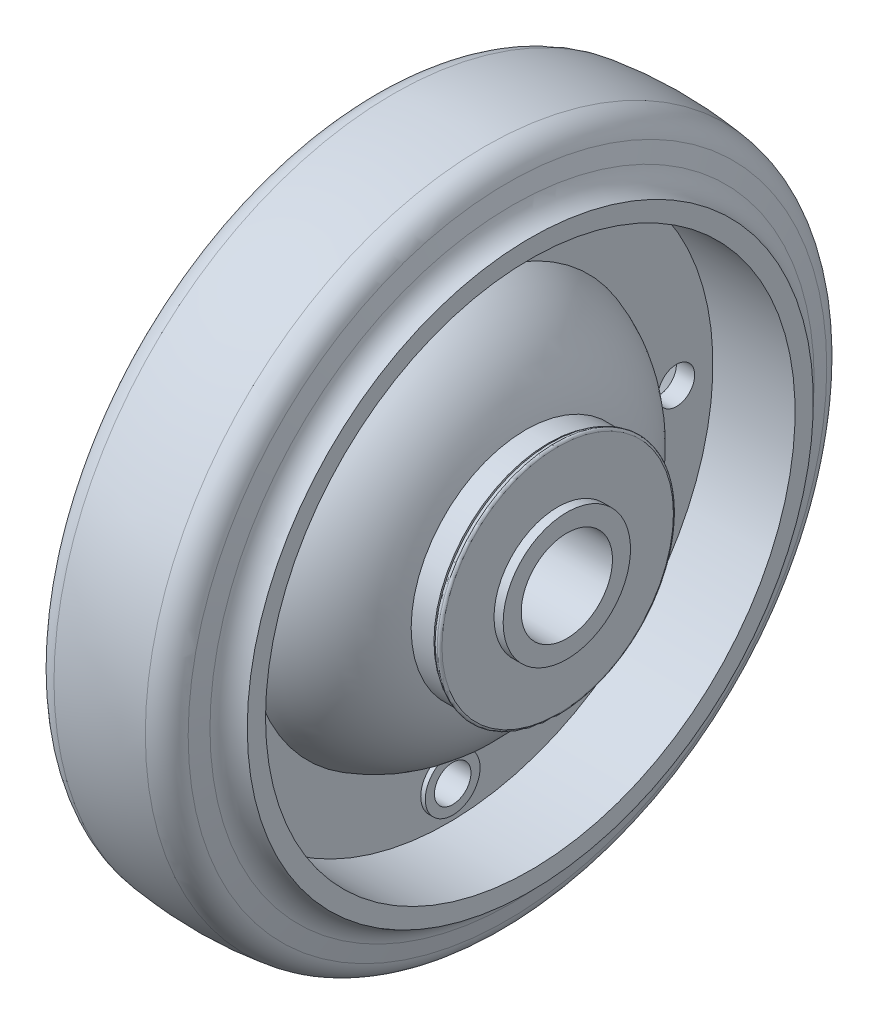
ISO-10303-21;
HEADER;
FILE_DESCRIPTION(('STEP AP214'),'2;1');
FILE_NAME('part.step','',(''),(''),'','','');
FILE_SCHEMA(('AUTOMOTIVE_DESIGN { 1 0 10303 214 1 1 1 1 }'));
ENDSEC;
DATA;
#1=APPLICATION_CONTEXT('core data for automotive mechanical design processes');
#2=APPLICATION_PROTOCOL_DEFINITION('international standard','automotive_design',2000,#1);
#3=PRODUCT_CONTEXT('',#1,'mechanical');
#4=PRODUCT('Part','Part','',(#3));
#5=PRODUCT_RELATED_PRODUCT_CATEGORY('part','',(#4));
#6=PRODUCT_DEFINITION_FORMATION('','',#4);
#7=PRODUCT_DEFINITION_CONTEXT('part definition',#1,'design');
#8=PRODUCT_DEFINITION('design','',#6,#7);
#9=PRODUCT_DEFINITION_SHAPE('','',#8);
#10=(LENGTH_UNIT() NAMED_UNIT(*) SI_UNIT(.MILLI.,.METRE.));
#11=(NAMED_UNIT(*) PLANE_ANGLE_UNIT() SI_UNIT($,.RADIAN.));
#12=(NAMED_UNIT(*) SI_UNIT($,.STERADIAN.) SOLID_ANGLE_UNIT());
#13=UNCERTAINTY_MEASURE_WITH_UNIT(LENGTH_MEASURE(1.E-05),#10,'distance_accuracy_value','');
#14=(GEOMETRIC_REPRESENTATION_CONTEXT(3) GLOBAL_UNCERTAINTY_ASSIGNED_CONTEXT((#13)) GLOBAL_UNIT_ASSIGNED_CONTEXT((#10,
#11,#12)) REPRESENTATION_CONTEXT('',''));
#15=CARTESIAN_POINT('',(0.,0.,0.));
#16=DIRECTION('',(0.,0.,1.));
#17=DIRECTION('',(1.,0.,0.));
#18=AXIS2_PLACEMENT_3D('',#15,#16,#17);
#19=CARTESIAN_POINT('',(2.,58.,0.));
#20=DIRECTION('',(-1.,0.,0.));
#21=DIRECTION('',(0.,0.,1.));
#22=AXIS2_PLACEMENT_3D('',#19,#20,#21);
#23=PLANE('',#22);
#24=CARTESIAN_POINT('',(2.,50.,0.));
#25=DIRECTION('',(-1.,0.,0.));
#26=DIRECTION('',(0.,0.,1.));
#27=AXIS2_PLACEMENT_3D('',#24,#25,#26);
#28=CIRCLE('',#27,6.);
#29=CARTESIAN_POINT('',(2.,50.,6.00000000000002));
#30=VERTEX_POINT('',#29);
#31=EDGE_CURVE('E19',#30,#30,#28,.F.);
#32=ORIENTED_EDGE('',*,*,#31,.F.);
#33=EDGE_LOOP('',(#32));
#34=FACE_BOUND('',#33,.T.);
#35=CARTESIAN_POINT('',(2.,0.,50.));
#36=DIRECTION('',(1.,0.,0.));
#37=DIRECTION('',(0.,0.,-1.));
#38=AXIS2_PLACEMENT_3D('',#35,#36,#37);
#39=CIRCLE('',#38,3.99999999999999);
#40=CARTESIAN_POINT('',(2.,0.,46.));
#41=VERTEX_POINT('',#40);
#42=EDGE_CURVE('E137',#41,#41,#39,.T.);
#43=ORIENTED_EDGE('',*,*,#42,.F.);
#44=EDGE_LOOP('',(#43));
#45=FACE_BOUND('',#44,.T.);
#46=CARTESIAN_POINT('',(2.,0.,-50.));
#47=DIRECTION('',(1.,0.,0.));
#48=DIRECTION('',(0.,0.,-1.));
#49=AXIS2_PLACEMENT_3D('',#46,#47,#48);
#50=CIRCLE('',#49,3.99999999999999);
#51=CARTESIAN_POINT('',(2.,0.,-54.));
#52=VERTEX_POINT('',#51);
#53=EDGE_CURVE('E131',#52,#52,#50,.T.);
#54=ORIENTED_EDGE('',*,*,#53,.F.);
#55=EDGE_LOOP('',(#54));
#56=FACE_BOUND('',#55,.T.);
#57=CARTESIAN_POINT('',(2.,0.,0.));
#58=DIRECTION('',(-1.,0.,0.));
#59=DIRECTION('',(0.,0.,1.));
#60=AXIS2_PLACEMENT_3D('',#57,#58,#59);
#61=CIRCLE('',#60,58.);
#62=CARTESIAN_POINT('',(2.,0.,58.));
#63=VERTEX_POINT('',#62);
#64=EDGE_CURVE('E56',#63,#63,#61,.T.);
#65=ORIENTED_EDGE('',*,*,#64,.F.);
#66=EDGE_LOOP('',(#65));
#67=FACE_BOUND('',#66,.T.);
#68=CARTESIAN_POINT('',(2.,0.,0.));
#69=DIRECTION('',(-1.,0.,0.));
#70=DIRECTION('',(0.,0.,1.));
#71=AXIS2_PLACEMENT_3D('',#68,#69,#70);
#72=CIRCLE('',#71,43.5);
#73=CARTESIAN_POINT('',(2.,0.,43.5));
#74=VERTEX_POINT('',#73);
#75=EDGE_CURVE('E53',#74,#74,#72,.T.);
#76=ORIENTED_EDGE('',*,*,#75,.T.);
#77=EDGE_LOOP('',(#76));
#78=FACE_BOUND('',#77,.T.);
#79=CARTESIAN_POINT('',(2.,-50.,0.));
#80=DIRECTION('',(-1.,0.,0.));
#81=DIRECTION('',(0.,0.,1.));
#82=AXIS2_PLACEMENT_3D('',#79,#80,#81);
#83=CIRCLE('',#82,6.);
#84=CARTESIAN_POINT('',(2.,-50.,5.99999999999999));
#85=VERTEX_POINT('',#84);
#86=EDGE_CURVE('E8',#85,#85,#83,.F.);
#87=ORIENTED_EDGE('',*,*,#86,.F.);
#88=EDGE_LOOP('',(#87));
#89=FACE_BOUND('',#88,.T.);
#90=ADVANCED_FACE('F12',(#34,#45,#56,#67,#78,#89),#23,.F.);
#91=CARTESIAN_POINT('',(28.,0.,0.));
#92=DIRECTION('',(-1.,0.,0.));
#93=DIRECTION('',(0.,0.,1.));
#94=AXIS2_PLACEMENT_3D('',#91,#92,#93);
#95=PLANE('',#94);
#96=CARTESIAN_POINT('',(28.,0.,0.));
#97=DIRECTION('',(-1.,0.,0.));
#98=DIRECTION('',(0.,0.,1.));
#99=AXIS2_PLACEMENT_3D('',#96,#97,#98);
#100=CIRCLE('',#99,13.95);
#101=CARTESIAN_POINT('',(28.,0.,13.95));
#102=VERTEX_POINT('',#101);
#103=EDGE_CURVE('E23',#102,#102,#100,.T.);
#104=ORIENTED_EDGE('',*,*,#103,.F.);
#105=EDGE_LOOP('',(#104));
#106=FACE_BOUND('',#105,.T.);
#107=CARTESIAN_POINT('',(28.,0.,0.));
#108=DIRECTION('',(1.,0.,0.));
#109=DIRECTION('',(0.,0.,-1.));
#110=AXIS2_PLACEMENT_3D('',#107,#108,#109);
#111=CIRCLE('',#110,9.99999999999999);
#112=CARTESIAN_POINT('',(28.,0.,-9.99999999999999));
#113=VERTEX_POINT('',#112);
#114=EDGE_CURVE('E125',#113,#113,#111,.T.);
#115=ORIENTED_EDGE('',*,*,#114,.F.);
#116=EDGE_LOOP('',(#115));
#117=FACE_BOUND('',#116,.T.);
#118=ADVANCED_FACE('F193',(#106,#117),#95,.F.);
#119=CARTESIAN_POINT('',(-28.,0.,0.));
#120=DIRECTION('',(1.,0.,0.));
#121=DIRECTION('',(0.,0.,-1.));
#122=AXIS2_PLACEMENT_3D('',#119,#120,#121);
#123=PLANE('',#122);
#124=CARTESIAN_POINT('',(-28.,0.,0.));
#125=DIRECTION('',(1.,0.,0.));
#126=DIRECTION('',(0.,0.,-1.));
#127=AXIS2_PLACEMENT_3D('',#124,#125,#126);
#128=CIRCLE('',#127,9.99999999999999);
#129=CARTESIAN_POINT('',(-28.,0.,-9.99999999999999));
#130=VERTEX_POINT('',#129);
#131=EDGE_CURVE('E122',#130,#130,#128,.T.);
#132=ORIENTED_EDGE('',*,*,#131,.T.);
#133=EDGE_LOOP('',(#132));
#134=FACE_BOUND('',#133,.T.);
#135=CARTESIAN_POINT('',(-28.,0.,0.));
#136=DIRECTION('',(-1.,0.,0.));
#137=DIRECTION('',(0.,0.,1.));
#138=AXIS2_PLACEMENT_3D('',#135,#136,#137);
#139=CIRCLE('',#138,13.95);
#140=CARTESIAN_POINT('',(-28.,0.,13.95));
#141=VERTEX_POINT('',#140);
#142=EDGE_CURVE('E119',#141,#141,#139,.T.);
#143=ORIENTED_EDGE('',*,*,#142,.T.);
#144=EDGE_LOOP('',(#143));
#145=FACE_BOUND('',#144,.T.);
#146=ADVANCED_FACE('F14',(#134,#145),#123,.F.);
#147=CARTESIAN_POINT('',(-28.,0.,0.));
#148=DIRECTION('',(-1.,0.,0.));
#149=DIRECTION('',(0.,0.,1.));
#150=AXIS2_PLACEMENT_3D('',#147,#148,#149);
#151=CYLINDRICAL_SURFACE('',#150,13.95);
#152=CARTESIAN_POINT('',(26.,0.,0.));
#153=DIRECTION('',(-1.,0.,0.));
#154=DIRECTION('',(0.,0.,1.));
#155=AXIS2_PLACEMENT_3D('',#152,#153,#154);
#156=CIRCLE('',#155,13.95);
#157=CARTESIAN_POINT('',(26.,0.,13.95));
#158=VERTEX_POINT('',#157);
#159=EDGE_CURVE('E27',#158,#158,#156,.T.);
#160=ORIENTED_EDGE('',*,*,#159,.F.);
#161=EDGE_LOOP('',(#160));
#162=FACE_BOUND('',#161,.T.);
#163=ORIENTED_EDGE('',*,*,#103,.T.);
#164=EDGE_LOOP('',(#163));
#165=FACE_BOUND('',#164,.T.);
#166=ADVANCED_FACE('F237',(#162,#165),#151,.T.);
#167=CARTESIAN_POINT('',(26.,13.95,0.));
#168=DIRECTION('',(-1.,0.,0.));
#169=DIRECTION('',(0.,0.,1.));
#170=AXIS2_PLACEMENT_3D('',#167,#168,#169);
#171=PLANE('',#170);
#172=CARTESIAN_POINT('',(26.,0.,0.));
#173=DIRECTION('',(-1.,0.,0.));
#174=DIRECTION('',(0.,0.,1.));
#175=AXIS2_PLACEMENT_3D('',#172,#173,#174);
#176=CIRCLE('',#175,25.3517391357041);
#177=CARTESIAN_POINT('',(26.,0.,25.3517391357041));
#178=VERTEX_POINT('',#177);
#179=EDGE_CURVE('E32',#178,#178,#176,.T.);
#180=ORIENTED_EDGE('',*,*,#179,.F.);
#181=EDGE_LOOP('',(#180));
#182=FACE_BOUND('',#181,.T.);
#183=ORIENTED_EDGE('',*,*,#159,.T.);
#184=EDGE_LOOP('',(#183));
#185=FACE_BOUND('',#184,.T.);
#186=ADVANCED_FACE('F233',(#182,#185),#171,.F.);
#187=CARTESIAN_POINT('',(25.5,0.,0.));
#188=DIRECTION('',(-1.,0.,0.));
#189=DIRECTION('',(0.,0.,1.));
#190=AXIS2_PLACEMENT_3D('',#187,#188,#189);
#191=TOROIDAL_SURFACE('',#190,25.3517391357041,0.499999999999999);
#192=CARTESIAN_POINT('',(25.4583333333333,0.,0.));
#193=DIRECTION('',(-1.,0.,0.));
#194=DIRECTION('',(0.,0.,1.));
#195=AXIS2_PLACEMENT_3D('',#192,#193,#194);
#196=CIRCLE('',#195,25.85);
#197=CARTESIAN_POINT('',(25.4583333333333,0.,25.85));
#198=VERTEX_POINT('',#197);
#199=EDGE_CURVE('E35',#198,#198,#196,.T.);
#200=ORIENTED_EDGE('',*,*,#199,.F.);
#201=EDGE_LOOP('',(#200));
#202=FACE_BOUND('',#201,.T.);
#203=ORIENTED_EDGE('',*,*,#179,.T.);
#204=EDGE_LOOP('',(#203));
#205=FACE_BOUND('',#204,.T.);
#206=ADVANCED_FACE('F229',(#202,#205),#191,.T.);
#207=CARTESIAN_POINT('',(25.575,0.,0.));
#208=DIRECTION('',(-1.,0.,0.));
#209=DIRECTION('',(0.,0.,1.));
#210=AXIS2_PLACEMENT_3D('',#207,#208,#209);
#211=TOROIDAL_SURFACE('',#210,24.4548695799715,1.4);
#212=CARTESIAN_POINT('',(24.5,0.,0.));
#213=DIRECTION('',(-1.,0.,0.));
#214=DIRECTION('',(0.,0.,1.));
#215=AXIS2_PLACEMENT_3D('',#212,#213,#214);
#216=CIRCLE('',#215,25.3517391357041);
#217=CARTESIAN_POINT('',(24.5,0.,25.3517391357041));
#218=VERTEX_POINT('',#217);
#219=EDGE_CURVE('E38',#218,#218,#216,.T.);
#220=ORIENTED_EDGE('',*,*,#219,.F.);
#221=EDGE_LOOP('',(#220));
#222=FACE_BOUND('',#221,.T.);
#223=ORIENTED_EDGE('',*,*,#199,.T.);
#224=EDGE_LOOP('',(#223));
#225=FACE_BOUND('',#224,.T.);
#226=ADVANCED_FACE('F225',(#222,#225),#211,.T.);
#227=CARTESIAN_POINT('',(24.5,25.3517391357041,0.));
#228=DIRECTION('',(1.,0.,0.));
#229=DIRECTION('',(0.,0.,-1.));
#230=AXIS2_PLACEMENT_3D('',#227,#228,#229);
#231=PLANE('',#230);
#232=CARTESIAN_POINT('',(24.5,0.,0.));
#233=DIRECTION('',(-1.,0.,0.));
#234=DIRECTION('',(0.,0.,1.));
#235=AXIS2_PLACEMENT_3D('',#232,#233,#234);
#236=CIRCLE('',#235,24.4660254037844);
#237=CARTESIAN_POINT('',(24.5,0.,24.4660254037844));
#238=VERTEX_POINT('',#237);
#239=EDGE_CURVE('E41',#238,#238,#236,.T.);
#240=ORIENTED_EDGE('',*,*,#239,.F.);
#241=EDGE_LOOP('',(#240));
#242=FACE_BOUND('',#241,.T.);
#243=ORIENTED_EDGE('',*,*,#219,.T.);
#244=EDGE_LOOP('',(#243));
#245=FACE_BOUND('',#244,.T.);
#246=ADVANCED_FACE('F221',(#242,#245),#231,.F.);
#247=CARTESIAN_POINT('',(23.5,0.,0.));
#248=DIRECTION('',(-1.,0.,0.));
#249=DIRECTION('',(0.,0.,1.));
#250=AXIS2_PLACEMENT_3D('',#247,#248,#249);
#251=TOROIDAL_SURFACE('',#250,24.4660254037844,1.);
#252=CARTESIAN_POINT('',(24.,0.,0.));
#253=DIRECTION('',(-1.,0.,0.));
#254=DIRECTION('',(0.,0.,1.));
#255=AXIS2_PLACEMENT_3D('',#252,#253,#254);
#256=CIRCLE('',#255,23.6);
#257=CARTESIAN_POINT('',(24.,0.,23.6));
#258=VERTEX_POINT('',#257);
#259=EDGE_CURVE('E44',#258,#258,#256,.T.);
#260=ORIENTED_EDGE('',*,*,#259,.F.);
#261=EDGE_LOOP('',(#260));
#262=FACE_BOUND('',#261,.T.);
#263=ORIENTED_EDGE('',*,*,#239,.T.);
#264=EDGE_LOOP('',(#263));
#265=FACE_BOUND('',#264,.T.);
#266=ADVANCED_FACE('F217',(#262,#265),#251,.F.);
#267=CARTESIAN_POINT('',(24.,23.6,0.));
#268=DIRECTION('',(-1.,0.,0.));
#269=DIRECTION('',(0.,0.,1.));
#270=AXIS2_PLACEMENT_3D('',#267,#268,#269);
#271=PLANE('',#270);
#272=CARTESIAN_POINT('',(24.,0.,0.));
#273=DIRECTION('',(-1.,0.,0.));
#274=DIRECTION('',(0.,0.,1.));
#275=AXIS2_PLACEMENT_3D('',#272,#273,#274);
#276=CIRCLE('',#275,25.1);
#277=CARTESIAN_POINT('',(24.,0.,25.1));
#278=VERTEX_POINT('',#277);
#279=EDGE_CURVE('E47',#278,#278,#276,.T.);
#280=ORIENTED_EDGE('',*,*,#279,.F.);
#281=EDGE_LOOP('',(#280));
#282=FACE_BOUND('',#281,.T.);
#283=ORIENTED_EDGE('',*,*,#259,.T.);
#284=EDGE_LOOP('',(#283));
#285=FACE_BOUND('',#284,.T.);
#286=ADVANCED_FACE('F213',(#282,#285),#271,.F.);
#287=CARTESIAN_POINT('',(-28.,0.,0.));
#288=DIRECTION('',(-1.,0.,0.));
#289=DIRECTION('',(0.,0.,1.));
#290=AXIS2_PLACEMENT_3D('',#287,#288,#289);
#291=CYLINDRICAL_SURFACE('',#290,25.1);
#292=CARTESIAN_POINT('',(19.,0.,0.));
#293=DIRECTION('',(-1.,0.,0.));
#294=DIRECTION('',(0.,0.,1.));
#295=AXIS2_PLACEMENT_3D('',#292,#293,#294);
#296=CIRCLE('',#295,25.1);
#297=CARTESIAN_POINT('',(19.,0.,25.1));
#298=VERTEX_POINT('',#297);
#299=EDGE_CURVE('E50',#298,#298,#296,.T.);
#300=ORIENTED_EDGE('',*,*,#299,.F.);
#301=EDGE_LOOP('',(#300));
#302=FACE_BOUND('',#301,.T.);
#303=ORIENTED_EDGE('',*,*,#279,.T.);
#304=EDGE_LOOP('',(#303));
#305=FACE_BOUND('',#304,.T.);
#306=ADVANCED_FACE('F209',(#302,#305),#291,.T.);
#307=CARTESIAN_POINT('',(-5.39147303315493,0.,0.));
#308=DIRECTION('',(-1.,0.,0.));
#309=DIRECTION('',(0.,0.,1.));
#310=AXIS2_PLACEMENT_3D('',#307,#308,#309);
#311=DEGENERATE_TOROIDAL_SURFACE('',#310,19.6176607845851,25.,.T.);
#312=ORIENTED_EDGE('',*,*,#75,.F.);
#313=EDGE_LOOP('',(#312));
#314=FACE_BOUND('',#313,.T.);
#315=ORIENTED_EDGE('',*,*,#299,.T.);
#316=EDGE_LOOP('',(#315));
#317=FACE_BOUND('',#316,.T.);
#318=ADVANCED_FACE('F206',(#314,#317),#311,.T.);
#319=CARTESIAN_POINT('',(-28.,0.,0.));
#320=DIRECTION('',(-1.,0.,0.));
#321=DIRECTION('',(0.,0.,1.));
#322=AXIS2_PLACEMENT_3D('',#319,#320,#321);
#323=CYLINDRICAL_SURFACE('',#322,58.);
#324=CARTESIAN_POINT('',(20.,0.,0.));
#325=DIRECTION('',(-1.,0.,0.));
#326=DIRECTION('',(0.,0.,1.));
#327=AXIS2_PLACEMENT_3D('',#324,#325,#326);
#328=CIRCLE('',#327,58.);
#329=CARTESIAN_POINT('',(20.,0.,58.));
#330=VERTEX_POINT('',#329);
#331=EDGE_CURVE('E59',#330,#330,#328,.T.);
#332=ORIENTED_EDGE('',*,*,#331,.F.);
#333=EDGE_LOOP('',(#332));
#334=FACE_BOUND('',#333,.T.);
#335=ORIENTED_EDGE('',*,*,#64,.T.);
#336=EDGE_LOOP('',(#335));
#337=FACE_BOUND('',#336,.T.);
#338=ADVANCED_FACE('F204',(#334,#337),#323,.F.);
#339=CARTESIAN_POINT('',(20.,62.,0.));
#340=DIRECTION('',(-1.,0.,0.));
#341=DIRECTION('',(0.,0.,1.));
#342=AXIS2_PLACEMENT_3D('',#339,#340,#341);
#343=PLANE('',#342);
#344=CARTESIAN_POINT('',(20.,0.,0.));
#345=DIRECTION('',(-1.,0.,0.));
#346=DIRECTION('',(0.,0.,1.));
#347=AXIS2_PLACEMENT_3D('',#344,#345,#346);
#348=CIRCLE('',#347,62.);
#349=CARTESIAN_POINT('',(20.,0.,62.));
#350=VERTEX_POINT('',#349);
#351=EDGE_CURVE('E62',#350,#350,#348,.T.);
#352=ORIENTED_EDGE('',*,*,#351,.F.);
#353=EDGE_LOOP('',(#352));
#354=FACE_BOUND('',#353,.T.);
#355=ORIENTED_EDGE('',*,*,#331,.T.);
#356=EDGE_LOOP('',(#355));
#357=FACE_BOUND('',#356,.T.);
#358=ADVANCED_FACE('F334',(#354,#357),#343,.F.);
#359=CARTESIAN_POINT('',(21.8002576459999,0.,0.));
#360=DIRECTION('',(-1.,0.,0.));
#361=DIRECTION('',(0.,0.,1.));
#362=AXIS2_PLACEMENT_3D('',#359,#360,#361);
#363=TOROIDAL_SURFACE('',#362,67.7235541762107,6.);
#364=CARTESIAN_POINT('',(16.0047026882654,0.,0.));
#365=DIRECTION('',(-1.,0.,0.));
#366=DIRECTION('',(0.,0.,1.));
#367=AXIS2_PLACEMENT_3D('',#364,#365,#366);
#368=CIRCLE('',#367,66.1706399055956);
#369=CARTESIAN_POINT('',(16.0047026882654,0.,66.1706399055956));
#370=VERTEX_POINT('',#369);
#371=EDGE_CURVE('E65',#370,#370,#368,.T.);
#372=ORIENTED_EDGE('',*,*,#371,.F.);
#373=EDGE_LOOP('',(#372));
#374=FACE_BOUND('',#373,.T.);
#375=ORIENTED_EDGE('',*,*,#351,.T.);
#376=EDGE_LOOP('',(#375));
#377=FACE_BOUND('',#376,.T.);
#378=ADVANCED_FACE('F331',(#374,#377),#363,.F.);
#379=CARTESIAN_POINT('',(16.0047026882654,0.,0.));
#380=DIRECTION('',(-1.,0.,0.));
#381=DIRECTION('',(0.,0.,1.));
#382=AXIS2_PLACEMENT_3D('',#379,#380,#381);
#383=CONICAL_SURFACE('',#382,66.1706399055956,1.30899693899575);
#384=CARTESIAN_POINT('',(14.9955549577344,0.,0.));
#385=DIRECTION('',(-1.,0.,0.));
#386=DIRECTION('',(0.,0.,1.));
#387=AXIS2_PLACEMENT_3D('',#384,#385,#386);
#388=CIRCLE('',#387,69.9368305082802);
#389=CARTESIAN_POINT('',(14.9955549577344,0.,69.9368305082802));
#390=VERTEX_POINT('',#389);
#391=EDGE_CURVE('E68',#390,#390,#388,.T.);
#392=ORIENTED_EDGE('',*,*,#391,.F.);
#393=EDGE_LOOP('',(#392));
#394=FACE_BOUND('',#393,.T.);
#395=ORIENTED_EDGE('',*,*,#371,.T.);
#396=EDGE_LOOP('',(#395));
#397=FACE_BOUND('',#396,.T.);
#398=ADVANCED_FACE('F327',(#394,#397),#383,.T.);
#399=CARTESIAN_POINT('',(9.2,0.,0.));
#400=DIRECTION('',(-1.,0.,0.));
#401=DIRECTION('',(0.,0.,1.));
#402=AXIS2_PLACEMENT_3D('',#399,#400,#401);
#403=TOROIDAL_SURFACE('',#402,68.3839162376651,6.00000000000001);
#404=CARTESIAN_POINT('',(10.,0.,0.));
#405=DIRECTION('',(-1.,0.,0.));
#406=DIRECTION('',(0.,0.,1.));
#407=AXIS2_PLACEMENT_3D('',#404,#405,#406);
#408=CIRCLE('',#407,74.3303437365925);
#409=CARTESIAN_POINT('',(10.,74.3303437365925,0.));
#410=VERTEX_POINT('',#409);
#411=EDGE_CURVE('E71',#410,#410,#408,.T.);
#412=ORIENTED_EDGE('',*,*,#411,.F.);
#413=EDGE_LOOP('',(#412));
#414=FACE_BOUND('',#413,.T.);
#415=ORIENTED_EDGE('',*,*,#391,.T.);
#416=EDGE_LOOP('',(#415));
#417=FACE_BOUND('',#416,.T.);
#418=ADVANCED_FACE('F323',(#414,#417),#403,.T.);
#419=CARTESIAN_POINT('',(0.,0.,0.));
#420=DIRECTION('',(-1.,0.,0.));
#421=DIRECTION('',(0.,1.,0.));
#422=AXIS2_PLACEMENT_3D('',#419,#420,#421);
#423=SPHERICAL_SURFACE('',#422,75.);
#424=CARTESIAN_POINT('',(-10.,0.,0.));
#425=DIRECTION('',(-1.,0.,0.));
#426=DIRECTION('',(0.,0.,1.));
#427=AXIS2_PLACEMENT_3D('',#424,#425,#426);
#428=CIRCLE('',#427,74.3303437365925);
#429=CARTESIAN_POINT('',(-10.,74.3303437365925,0.));
#430=VERTEX_POINT('',#429);
#431=EDGE_CURVE('E74',#430,#430,#428,.T.);
#432=CARTESIAN_POINT('',(-10.,74.3303437365925,0.));
#433=CARTESIAN_POINT('',(-9.7929101067184,74.3582045061215,0.));
#434=CARTESIAN_POINT('',(-9.58570377482389,74.3851997810597,0.));
#435=CARTESIAN_POINT('',(-9.17107272117384,74.4374575513478,0.));
#436=CARTESIAN_POINT('',(-8.9636479994183,74.4627200466978,0.));
#437=CARTESIAN_POINT('',(-8.54859465341098,74.511510467403,0.));
#438=CARTESIAN_POINT('',(-8.34096602915919,74.5350383927581,0.));
#439=CARTESIAN_POINT('',(-7.92551938385667,74.5803580366788,0.));
#440=CARTESIAN_POINT('',(-7.71770136280594,74.6021497552444,0.));
#441=CARTESIAN_POINT('',(-7.30189044173864,74.6439954613905,0.));
#442=CARTESIAN_POINT('',(-7.09389754172206,74.664049448971,0.));
#443=CARTESIAN_POINT('',(-6.67775139306662,74.7024182926775,0.));
#444=CARTESIAN_POINT('',(-6.46959814442776,74.7207331488035,0.));
#445=CARTESIAN_POINT('',(-6.05314583999454,74.7556224500022,0.));
#446=CARTESIAN_POINT('',(-5.84484678420018,74.7721968950749,0.));
#447=CARTESIAN_POINT('',(-5.42811741712985,74.8036042163199,0.));
#448=CARTESIAN_POINT('',(-5.21968710585387,74.8184370924921,0.));
#449=CARTESIAN_POINT('',(-4.80270978865799,74.8463602397092,0.));
#450=CARTESIAN_POINT('',(-4.59416278273808,74.859450510754,0.));
#451=CARTESIAN_POINT('',(-4.17696664524574,74.883887533239,0.));
#452=CARTESIAN_POINT('',(-3.96831751367331,74.8952342846791,0.));
#453=CARTESIAN_POINT('',(-3.5509317010014,74.9161834752754,0.));
#454=CARTESIAN_POINT('',(-3.34219501990192,74.9257859144317,0.));
#455=CARTESIAN_POINT('',(-2.92464869041764,74.9432458096388,0.));
#456=CARTESIAN_POINT('',(-2.71583904203283,74.9511032656897,0.));
#457=CARTESIAN_POINT('',(-2.29816136531708,74.965072645768,0.));
#458=CARTESIAN_POINT('',(-2.08929333698614,74.9711845697954,0.));
#459=CARTESIAN_POINT('',(-1.67151349179566,74.9816624588509,0.));
#460=CARTESIAN_POINT('',(-1.46260167493613,74.9860284238789,0.));
#461=CARTESIAN_POINT('',(-1.0447488471651,74.9930140899314,0.));
#462=CARTESIAN_POINT('',(-0.835807836253604,74.9956337909559,0.));
#463=CARTESIAN_POINT('',(-0.41791121689474,74.9991267459902,0.));
#464=CARTESIAN_POINT('',(-0.208955608447372,75.,0.));
#465=CARTESIAN_POINT('',(0.208955608447364,75.,0.));
#466=CARTESIAN_POINT('',(0.417911216894731,74.9991267459902,0.));
#467=CARTESIAN_POINT('',(0.835807836253596,74.9956337909559,0.));
#468=CARTESIAN_POINT('',(1.04474884716509,74.9930140899314,0.));
#469=CARTESIAN_POINT('',(1.46260167493612,74.9860284238789,0.));
#470=CARTESIAN_POINT('',(1.67151349179565,74.9816624588509,0.));
#471=CARTESIAN_POINT('',(2.08929333698613,74.9711845697954,0.));
#472=CARTESIAN_POINT('',(2.29816136531708,74.965072645768,0.));
#473=CARTESIAN_POINT('',(2.71583904203283,74.9511032656897,0.));
#474=CARTESIAN_POINT('',(2.92464869041763,74.9432458096388,0.));
#475=CARTESIAN_POINT('',(3.34219501990191,74.9257859144317,0.));
#476=CARTESIAN_POINT('',(3.55093170100139,74.9161834752754,0.));
#477=CARTESIAN_POINT('',(3.96831751367331,74.8952342846791,0.));
#478=CARTESIAN_POINT('',(4.17696664524574,74.883887533239,0.));
#479=CARTESIAN_POINT('',(4.59416278273807,74.859450510754,0.));
#480=CARTESIAN_POINT('',(4.80270978865798,74.8463602397092,0.));
#481=CARTESIAN_POINT('',(5.21968710585387,74.8184370924921,0.));
#482=CARTESIAN_POINT('',(5.42811741712984,74.8036042163199,0.));
#483=CARTESIAN_POINT('',(5.84484678420017,74.7721968950749,0.));
#484=CARTESIAN_POINT('',(6.05314583999453,74.7556224500022,0.));
#485=CARTESIAN_POINT('',(6.46959814442775,74.7207331488035,0.));
#486=CARTESIAN_POINT('',(6.67775139306661,74.7024182926775,0.));
#487=CARTESIAN_POINT('',(7.09389754172205,74.664049448971,0.));
#488=CARTESIAN_POINT('',(7.30189044173863,74.6439954613905,0.));
#489=CARTESIAN_POINT('',(7.71770136280593,74.6021497552444,0.));
#490=CARTESIAN_POINT('',(7.92551938385666,74.5803580366789,0.));
#491=CARTESIAN_POINT('',(8.34096602915918,74.5350383927581,0.));
#492=CARTESIAN_POINT('',(8.54859465341097,74.511510467403,0.));
#493=CARTESIAN_POINT('',(8.9636479994183,74.4627200466978,0.));
#494=CARTESIAN_POINT('',(9.17107272117383,74.4374575513478,0.));
#495=CARTESIAN_POINT('',(9.58570377482388,74.3851997810597,0.));
#496=CARTESIAN_POINT('',(9.79291010671839,74.3582045061215,0.));
#497=CARTESIAN_POINT('',(10.,74.3303437365925,0.));
#498=B_SPLINE_CURVE_WITH_KNOTS('',3,(#432,#433,#434,#435,#436,#437,#438,#439,#440,#441,#442,
#443,#444,#445,#446,#447,#448,#449,#450,#451,#452,#453,#454,#455,#456,#457,#458,#459,#460,#461,
#462,#463,#464,#465,#466,#467,#468,#469,#470,#471,#472,#473,#474,#475,#476,#477,#478,#479,#480,
#481,#482,#483,#484,#485,#486,#487,#488,#489,#490,#491,#492,#493,#494,#495,#496,#497),
.UNSPECIFIED.,.F.,.F.,(4,2,2,2,2,2,2,2,2,2,2,2,2,2,2,2,2,2,2,2,2,2,2,2,2,2,2,2,2,2,2,2,4),(0.,
0.626865000658086,1.25373000131617,1.88059500197426,2.50746000263235,3.13432500329044,
3.76119000394852,4.38805500460661,5.0149200052647,5.64178500592279,6.26865000658088,
6.89551500723896,7.52238000789705,8.14924500855514,8.77611000921323,9.40297500987132,
10.0298400105294,10.6567050111875,11.2835700118456,11.9104350125037,12.5373000131618,
13.1641650138198,13.7910300144779,14.417895015136,15.0447600157941,15.6716250164522,
16.2984900171103,16.9253550177684,17.5522200184265,18.1790850190845,18.8059500197426,
19.4328150204007,20.0596800210588),.UNSPECIFIED.);
#499=EDGE_CURVE('BSEAM319',#430,#410,#498,.T.);
#500=ORIENTED_EDGE('',*,*,#431,.F.);
#501=ORIENTED_EDGE('',*,*,#411,.T.);
#502=ORIENTED_EDGE('',*,*,#499,.T.);
#503=ORIENTED_EDGE('',*,*,#499,.F.);
#504=EDGE_LOOP('',(#500,#502,#501,#503));
#505=FACE_BOUND('',#504,.T.);
#506=ADVANCED_FACE('F319',(#505),#423,.T.);
#507=CARTESIAN_POINT('',(-9.2,0.,0.));
#508=DIRECTION('',(-1.,0.,0.));
#509=DIRECTION('',(0.,0.,1.));
#510=AXIS2_PLACEMENT_3D('',#507,#508,#509);
#511=TOROIDAL_SURFACE('',#510,68.3839162376651,6.00000000000001);
#512=CARTESIAN_POINT('',(-14.9955549577344,0.,0.));
#513=DIRECTION('',(-1.,0.,0.));
#514=DIRECTION('',(0.,0.,1.));
#515=AXIS2_PLACEMENT_3D('',#512,#513,#514);
#516=CIRCLE('',#515,69.9368305082802);
#517=CARTESIAN_POINT('',(-14.9955549577344,0.,69.9368305082802));
#518=VERTEX_POINT('',#517);
#519=EDGE_CURVE('E77',#518,#518,#516,.T.);
#520=ORIENTED_EDGE('',*,*,#519,.F.);
#521=EDGE_LOOP('',(#520));
#522=FACE_BOUND('',#521,.T.);
#523=ORIENTED_EDGE('',*,*,#431,.T.);
#524=EDGE_LOOP('',(#523));
#525=FACE_BOUND('',#524,.T.);
#526=ADVANCED_FACE('F315',(#522,#525),#511,.T.);
#527=CARTESIAN_POINT('',(-14.9955549577344,0.,0.));
#528=DIRECTION('',(1.,0.,0.));
#529=DIRECTION('',(0.,0.,-1.));
#530=AXIS2_PLACEMENT_3D('',#527,#528,#529);
#531=CONICAL_SURFACE('',#530,69.9368305082802,1.30899693899575);
#532=CARTESIAN_POINT('',(-16.0047026882654,0.,0.));
#533=DIRECTION('',(-1.,0.,0.));
#534=DIRECTION('',(0.,0.,1.));
#535=AXIS2_PLACEMENT_3D('',#532,#533,#534);
#536=CIRCLE('',#535,66.1706399055956);
#537=CARTESIAN_POINT('',(-16.0047026882654,0.,66.1706399055956));
#538=VERTEX_POINT('',#537);
#539=EDGE_CURVE('E80',#538,#538,#536,.T.);
#540=ORIENTED_EDGE('',*,*,#539,.F.);
#541=EDGE_LOOP('',(#540));
#542=FACE_BOUND('',#541,.T.);
#543=ORIENTED_EDGE('',*,*,#519,.T.);
#544=EDGE_LOOP('',(#543));
#545=FACE_BOUND('',#544,.T.);
#546=ADVANCED_FACE('F311',(#542,#545),#531,.T.);
#547=CARTESIAN_POINT('',(-21.8002576459999,0.,0.));
#548=DIRECTION('',(-1.,0.,0.));
#549=DIRECTION('',(0.,0.,1.));
#550=AXIS2_PLACEMENT_3D('',#547,#548,#549);
#551=TOROIDAL_SURFACE('',#550,67.7235541762107,6.);
#552=CARTESIAN_POINT('',(-20.,0.,0.));
#553=DIRECTION('',(-1.,0.,0.));
#554=DIRECTION('',(0.,0.,1.));
#555=AXIS2_PLACEMENT_3D('',#552,#553,#554);
#556=CIRCLE('',#555,62.);
#557=CARTESIAN_POINT('',(-20.,0.,62.));
#558=VERTEX_POINT('',#557);
#559=EDGE_CURVE('E83',#558,#558,#556,.T.);
#560=ORIENTED_EDGE('',*,*,#559,.F.);
#561=EDGE_LOOP('',(#560));
#562=FACE_BOUND('',#561,.T.);
#563=ORIENTED_EDGE('',*,*,#539,.T.);
#564=EDGE_LOOP('',(#563));
#565=FACE_BOUND('',#564,.T.);
#566=ADVANCED_FACE('F307',(#562,#565),#551,.F.);
#567=CARTESIAN_POINT('',(-20.,62.,0.));
#568=DIRECTION('',(1.,0.,0.));
#569=DIRECTION('',(0.,0.,-1.));
#570=AXIS2_PLACEMENT_3D('',#567,#568,#569);
#571=PLANE('',#570);
#572=CARTESIAN_POINT('',(-20.,0.,0.));
#573=DIRECTION('',(-1.,0.,0.));
#574=DIRECTION('',(0.,0.,1.));
#575=AXIS2_PLACEMENT_3D('',#572,#573,#574);
#576=CIRCLE('',#575,58.);
#577=CARTESIAN_POINT('',(-20.,0.,58.));
#578=VERTEX_POINT('',#577);
#579=EDGE_CURVE('E86',#578,#578,#576,.T.);
#580=ORIENTED_EDGE('',*,*,#579,.F.);
#581=EDGE_LOOP('',(#580));
#582=FACE_BOUND('',#581,.T.);
#583=ORIENTED_EDGE('',*,*,#559,.T.);
#584=EDGE_LOOP('',(#583));
#585=FACE_BOUND('',#584,.T.);
#586=ADVANCED_FACE('F303',(#582,#585),#571,.F.);
#587=CARTESIAN_POINT('',(-28.,0.,0.));
#588=DIRECTION('',(-1.,0.,0.));
#589=DIRECTION('',(0.,0.,1.));
#590=AXIS2_PLACEMENT_3D('',#587,#588,#589);
#591=CYLINDRICAL_SURFACE('',#590,58.);
#592=CARTESIAN_POINT('',(-2.,0.,0.));
#593=DIRECTION('',(-1.,0.,0.));
#594=DIRECTION('',(0.,0.,1.));
#595=AXIS2_PLACEMENT_3D('',#592,#593,#594);
#596=CIRCLE('',#595,58.);
#597=CARTESIAN_POINT('',(-2.,0.,58.));
#598=VERTEX_POINT('',#597);
#599=EDGE_CURVE('E89',#598,#598,#596,.T.);
#600=ORIENTED_EDGE('',*,*,#599,.F.);
#601=EDGE_LOOP('',(#600));
#602=FACE_BOUND('',#601,.T.);
#603=ORIENTED_EDGE('',*,*,#579,.T.);
#604=EDGE_LOOP('',(#603));
#605=FACE_BOUND('',#604,.T.);
#606=ADVANCED_FACE('F299',(#602,#605),#591,.F.);
#607=CARTESIAN_POINT('',(-2.,58.,0.));
#608=DIRECTION('',(1.,0.,0.));
#609=DIRECTION('',(0.,0.,-1.));
#610=AXIS2_PLACEMENT_3D('',#607,#608,#609);
#611=PLANE('',#610);
#612=CARTESIAN_POINT('',(-2.,-50.,0.));
#613=DIRECTION('',(1.,0.,0.));
#614=DIRECTION('',(0.,0.,-1.));
#615=AXIS2_PLACEMENT_3D('',#612,#613,#614);
#616=CIRCLE('',#615,6.);
#617=CARTESIAN_POINT('',(-2.,-50.,-6.00000000000001));
#618=VERTEX_POINT('',#617);
#619=EDGE_CURVE('E162',#618,#618,#616,.T.);
#620=ORIENTED_EDGE('',*,*,#619,.T.);
#621=EDGE_LOOP('',(#620));
#622=FACE_BOUND('',#621,.T.);
#623=CARTESIAN_POINT('',(-2.,50.,0.));
#624=DIRECTION('',(1.,0.,0.));
#625=DIRECTION('',(0.,0.,-1.));
#626=AXIS2_PLACEMENT_3D('',#623,#624,#625);
#627=CIRCLE('',#626,6.);
#628=CARTESIAN_POINT('',(-2.,50.,-5.99999999999998));
#629=VERTEX_POINT('',#628);
#630=EDGE_CURVE('E153',#629,#629,#627,.T.);
#631=ORIENTED_EDGE('',*,*,#630,.T.);
#632=EDGE_LOOP('',(#631));
#633=FACE_BOUND('',#632,.T.);
#634=CARTESIAN_POINT('',(-2.,0.,50.));
#635=DIRECTION('',(1.,0.,0.));
#636=DIRECTION('',(0.,0.,-1.));
#637=AXIS2_PLACEMENT_3D('',#634,#635,#636);
#638=CIRCLE('',#637,3.99999999999999);
#639=CARTESIAN_POINT('',(-2.,0.,46.));
#640=VERTEX_POINT('',#639);
#641=EDGE_CURVE('E134',#640,#640,#638,.T.);
#642=ORIENTED_EDGE('',*,*,#641,.T.);
#643=EDGE_LOOP('',(#642));
#644=FACE_BOUND('',#643,.T.);
#645=CARTESIAN_POINT('',(-2.,0.,-50.));
#646=DIRECTION('',(1.,0.,0.));
#647=DIRECTION('',(0.,0.,-1.));
#648=AXIS2_PLACEMENT_3D('',#645,#646,#647);
#649=CIRCLE('',#648,3.99999999999999);
#650=CARTESIAN_POINT('',(-2.,0.,-54.));
#651=VERTEX_POINT('',#650);
#652=EDGE_CURVE('E128',#651,#651,#649,.T.);
#653=ORIENTED_EDGE('',*,*,#652,.T.);
#654=EDGE_LOOP('',(#653));
#655=FACE_BOUND('',#654,.T.);
#656=CARTESIAN_POINT('',(-2.,0.,0.));
#657=DIRECTION('',(-1.,0.,0.));
#658=DIRECTION('',(0.,0.,1.));
#659=AXIS2_PLACEMENT_3D('',#656,#657,#658);
#660=CIRCLE('',#659,43.5);
#661=CARTESIAN_POINT('',(-2.,0.,43.5));
#662=VERTEX_POINT('',#661);
#663=EDGE_CURVE('E92',#662,#662,#660,.T.);
#664=ORIENTED_EDGE('',*,*,#663,.F.);
#665=EDGE_LOOP('',(#664));
#666=FACE_BOUND('',#665,.T.);
#667=ORIENTED_EDGE('',*,*,#599,.T.);
#668=EDGE_LOOP('',(#667));
#669=FACE_BOUND('',#668,.T.);
#670=ADVANCED_FACE('F295',(#622,#633,#644,#655,#666,#669),#611,.F.);
#671=CARTESIAN_POINT('',(5.39147303315493,0.,0.));
#672=DIRECTION('',(-1.,0.,0.));
#673=DIRECTION('',(0.,0.,1.));
#674=AXIS2_PLACEMENT_3D('',#671,#672,#673);
#675=DEGENERATE_TOROIDAL_SURFACE('',#674,19.6176607845851,25.,.T.);
#676=CARTESIAN_POINT('',(-19.,0.,0.));
#677=DIRECTION('',(-1.,0.,0.));
#678=DIRECTION('',(0.,0.,1.));
#679=AXIS2_PLACEMENT_3D('',#676,#677,#678);
#680=CIRCLE('',#679,25.1);
#681=CARTESIAN_POINT('',(-19.,0.,25.1));
#682=VERTEX_POINT('',#681);
#683=EDGE_CURVE('E95',#682,#682,#680,.T.);
#684=ORIENTED_EDGE('',*,*,#683,.F.);
#685=EDGE_LOOP('',(#684));
#686=FACE_BOUND('',#685,.T.);
#687=ORIENTED_EDGE('',*,*,#663,.T.);
#688=EDGE_LOOP('',(#687));
#689=FACE_BOUND('',#688,.T.);
#690=ADVANCED_FACE('F291',(#686,#689),#675,.T.);
#691=CARTESIAN_POINT('',(-28.,0.,0.));
#692=DIRECTION('',(-1.,0.,0.));
#693=DIRECTION('',(0.,0.,1.));
#694=AXIS2_PLACEMENT_3D('',#691,#692,#693);
#695=CYLINDRICAL_SURFACE('',#694,25.1);
#696=CARTESIAN_POINT('',(-24.,0.,0.));
#697=DIRECTION('',(-1.,0.,0.));
#698=DIRECTION('',(0.,0.,1.));
#699=AXIS2_PLACEMENT_3D('',#696,#697,#698);
#700=CIRCLE('',#699,25.1);
#701=CARTESIAN_POINT('',(-24.,0.,25.1));
#702=VERTEX_POINT('',#701);
#703=EDGE_CURVE('E98',#702,#702,#700,.T.);
#704=ORIENTED_EDGE('',*,*,#703,.F.);
#705=EDGE_LOOP('',(#704));
#706=FACE_BOUND('',#705,.T.);
#707=ORIENTED_EDGE('',*,*,#683,.T.);
#708=EDGE_LOOP('',(#707));
#709=FACE_BOUND('',#708,.T.);
#710=ADVANCED_FACE('F287',(#706,#709),#695,.T.);
#711=CARTESIAN_POINT('',(-24.,23.6,0.));
#712=DIRECTION('',(1.,0.,0.));
#713=DIRECTION('',(0.,0.,-1.));
#714=AXIS2_PLACEMENT_3D('',#711,#712,#713);
#715=PLANE('',#714);
#716=CARTESIAN_POINT('',(-24.,0.,0.));
#717=DIRECTION('',(-1.,0.,0.));
#718=DIRECTION('',(0.,0.,1.));
#719=AXIS2_PLACEMENT_3D('',#716,#717,#718);
#720=CIRCLE('',#719,23.6);
#721=CARTESIAN_POINT('',(-24.,0.,23.6));
#722=VERTEX_POINT('',#721);
#723=EDGE_CURVE('E101',#722,#722,#720,.T.);
#724=ORIENTED_EDGE('',*,*,#723,.F.);
#725=EDGE_LOOP('',(#724));
#726=FACE_BOUND('',#725,.T.);
#727=ORIENTED_EDGE('',*,*,#703,.T.);
#728=EDGE_LOOP('',(#727));
#729=FACE_BOUND('',#728,.T.);
#730=ADVANCED_FACE('F283',(#726,#729),#715,.F.);
#731=CARTESIAN_POINT('',(-23.5,0.,0.));
#732=DIRECTION('',(-1.,0.,0.));
#733=DIRECTION('',(0.,0.,1.));
#734=AXIS2_PLACEMENT_3D('',#731,#732,#733);
#735=TOROIDAL_SURFACE('',#734,24.4660254037844,1.);
#736=CARTESIAN_POINT('',(-24.5,0.,0.));
#737=DIRECTION('',(-1.,0.,0.));
#738=DIRECTION('',(0.,0.,1.));
#739=AXIS2_PLACEMENT_3D('',#736,#737,#738);
#740=CIRCLE('',#739,24.4660254037844);
#741=CARTESIAN_POINT('',(-24.5,0.,24.4660254037844));
#742=VERTEX_POINT('',#741);
#743=EDGE_CURVE('E104',#742,#742,#740,.T.);
#744=ORIENTED_EDGE('',*,*,#743,.F.);
#745=EDGE_LOOP('',(#744));
#746=FACE_BOUND('',#745,.T.);
#747=ORIENTED_EDGE('',*,*,#723,.T.);
#748=EDGE_LOOP('',(#747));
#749=FACE_BOUND('',#748,.T.);
#750=ADVANCED_FACE('F279',(#746,#749),#735,.F.);
#751=CARTESIAN_POINT('',(-24.5,25.3517391357041,0.));
#752=DIRECTION('',(-1.,0.,0.));
#753=DIRECTION('',(0.,0.,1.));
#754=AXIS2_PLACEMENT_3D('',#751,#752,#753);
#755=PLANE('',#754);
#756=CARTESIAN_POINT('',(-24.5,0.,0.));
#757=DIRECTION('',(-1.,0.,0.));
#758=DIRECTION('',(0.,0.,1.));
#759=AXIS2_PLACEMENT_3D('',#756,#757,#758);
#760=CIRCLE('',#759,25.3517391357041);
#761=CARTESIAN_POINT('',(-24.5,0.,25.3517391357041));
#762=VERTEX_POINT('',#761);
#763=EDGE_CURVE('E107',#762,#762,#760,.T.);
#764=ORIENTED_EDGE('',*,*,#763,.F.);
#765=EDGE_LOOP('',(#764));
#766=FACE_BOUND('',#765,.T.);
#767=ORIENTED_EDGE('',*,*,#743,.T.);
#768=EDGE_LOOP('',(#767));
#769=FACE_BOUND('',#768,.T.);
#770=ADVANCED_FACE('F275',(#766,#769),#755,.F.);
#771=CARTESIAN_POINT('',(-25.575,0.,0.));
#772=DIRECTION('',(-1.,0.,0.));
#773=DIRECTION('',(0.,0.,1.));
#774=AXIS2_PLACEMENT_3D('',#771,#772,#773);
#775=TOROIDAL_SURFACE('',#774,24.4548695799715,1.4);
#776=CARTESIAN_POINT('',(-25.4583333333333,0.,0.));
#777=DIRECTION('',(-1.,0.,0.));
#778=DIRECTION('',(0.,0.,1.));
#779=AXIS2_PLACEMENT_3D('',#776,#777,#778);
#780=CIRCLE('',#779,25.85);
#781=CARTESIAN_POINT('',(-25.4583333333333,0.,25.85));
#782=VERTEX_POINT('',#781);
#783=EDGE_CURVE('E110',#782,#782,#780,.T.);
#784=ORIENTED_EDGE('',*,*,#783,.F.);
#785=EDGE_LOOP('',(#784));
#786=FACE_BOUND('',#785,.T.);
#787=ORIENTED_EDGE('',*,*,#763,.T.);
#788=EDGE_LOOP('',(#787));
#789=FACE_BOUND('',#788,.T.);
#790=ADVANCED_FACE('F271',(#786,#789),#775,.T.);
#791=CARTESIAN_POINT('',(-25.5,0.,0.));
#792=DIRECTION('',(-1.,0.,0.));
#793=DIRECTION('',(0.,0.,1.));
#794=AXIS2_PLACEMENT_3D('',#791,#792,#793);
#795=TOROIDAL_SURFACE('',#794,25.3517391357041,0.499999999999999);
#796=CARTESIAN_POINT('',(-26.,0.,0.));
#797=DIRECTION('',(-1.,0.,0.));
#798=DIRECTION('',(0.,0.,1.));
#799=AXIS2_PLACEMENT_3D('',#796,#797,#798);
#800=CIRCLE('',#799,25.3517391357041);
#801=CARTESIAN_POINT('',(-26.,0.,25.3517391357041));
#802=VERTEX_POINT('',#801);
#803=EDGE_CURVE('E113',#802,#802,#800,.T.);
#804=ORIENTED_EDGE('',*,*,#803,.F.);
#805=EDGE_LOOP('',(#804));
#806=FACE_BOUND('',#805,.T.);
#807=ORIENTED_EDGE('',*,*,#783,.T.);
#808=EDGE_LOOP('',(#807));
#809=FACE_BOUND('',#808,.T.);
#810=ADVANCED_FACE('F267',(#806,#809),#795,.T.);
#811=CARTESIAN_POINT('',(-26.,13.95,0.));
#812=DIRECTION('',(1.,0.,0.));
#813=DIRECTION('',(0.,0.,-1.));
#814=AXIS2_PLACEMENT_3D('',#811,#812,#813);
#815=PLANE('',#814);
#816=CARTESIAN_POINT('',(-26.,0.,0.));
#817=DIRECTION('',(-1.,0.,0.));
#818=DIRECTION('',(0.,0.,1.));
#819=AXIS2_PLACEMENT_3D('',#816,#817,#818);
#820=CIRCLE('',#819,13.95);
#821=CARTESIAN_POINT('',(-26.,0.,13.95));
#822=VERTEX_POINT('',#821);
#823=EDGE_CURVE('E116',#822,#822,#820,.T.);
#824=ORIENTED_EDGE('',*,*,#823,.F.);
#825=EDGE_LOOP('',(#824));
#826=FACE_BOUND('',#825,.T.);
#827=ORIENTED_EDGE('',*,*,#803,.T.);
#828=EDGE_LOOP('',(#827));
#829=FACE_BOUND('',#828,.T.);
#830=ADVANCED_FACE('F260',(#826,#829),#815,.F.);
#831=CARTESIAN_POINT('',(-28.,0.,0.));
#832=DIRECTION('',(-1.,0.,0.));
#833=DIRECTION('',(0.,0.,1.));
#834=AXIS2_PLACEMENT_3D('',#831,#832,#833);
#835=CYLINDRICAL_SURFACE('',#834,13.95);
#836=ORIENTED_EDGE('',*,*,#142,.F.);
#837=EDGE_LOOP('',(#836));
#838=FACE_BOUND('',#837,.T.);
#839=ORIENTED_EDGE('',*,*,#823,.T.);
#840=EDGE_LOOP('',(#839));
#841=FACE_BOUND('',#840,.T.);
#842=ADVANCED_FACE('F253',(#838,#841),#835,.T.);
#843=CARTESIAN_POINT('',(28.,0.,0.));
#844=DIRECTION('',(1.,0.,0.));
#845=DIRECTION('',(0.,0.,-1.));
#846=AXIS2_PLACEMENT_3D('',#843,#844,#845);
#847=CYLINDRICAL_SURFACE('',#846,9.99999999999999);
#848=ORIENTED_EDGE('',*,*,#131,.F.);
#849=EDGE_LOOP('',(#848));
#850=FACE_BOUND('',#849,.T.);
#851=ORIENTED_EDGE('',*,*,#114,.T.);
#852=EDGE_LOOP('',(#851));
#853=FACE_BOUND('',#852,.T.);
#854=ADVANCED_FACE('F189',(#850,#853),#847,.F.);
#855=CARTESIAN_POINT('',(2.,0.,-50.));
#856=DIRECTION('',(1.,0.,0.));
#857=DIRECTION('',(0.,0.,-1.));
#858=AXIS2_PLACEMENT_3D('',#855,#856,#857);
#859=CYLINDRICAL_SURFACE('',#858,3.99999999999999);
#860=ORIENTED_EDGE('',*,*,#652,.F.);
#861=EDGE_LOOP('',(#860));
#862=FACE_BOUND('',#861,.T.);
#863=ORIENTED_EDGE('',*,*,#53,.T.);
#864=EDGE_LOOP('',(#863));
#865=FACE_BOUND('',#864,.T.);
#866=ADVANCED_FACE('F177',(#862,#865),#859,.F.);
#867=CARTESIAN_POINT('',(2.,-50.,0.));
#868=DIRECTION('',(1.,0.,0.));
#869=DIRECTION('',(0.,0.,-1.));
#870=AXIS2_PLACEMENT_3D('',#867,#868,#869);
#871=CYLINDRICAL_SURFACE('',#870,3.99999999999999);
#872=CARTESIAN_POINT('',(3.,-50.,0.));
#873=DIRECTION('',(1.,0.,0.));
#874=DIRECTION('',(0.,0.,-1.));
#875=AXIS2_PLACEMENT_3D('',#872,#873,#874);
#876=CIRCLE('',#875,3.99999999999999);
#877=CARTESIAN_POINT('',(3.,-50.,-4.));
#878=VERTEX_POINT('',#877);
#879=EDGE_CURVE('E149',#878,#878,#876,.T.);
#880=ORIENTED_EDGE('',*,*,#879,.T.);
#881=EDGE_LOOP('',(#880));
#882=FACE_BOUND('',#881,.T.);
#883=CARTESIAN_POINT('',(-3.,-50.,0.));
#884=DIRECTION('',(1.,0.,0.));
#885=DIRECTION('',(0.,0.,-1.));
#886=AXIS2_PLACEMENT_3D('',#883,#884,#885);
#887=CIRCLE('',#886,3.99999999999999);
#888=CARTESIAN_POINT('',(-3.,-50.,-4.));
#889=VERTEX_POINT('',#888);
#890=EDGE_CURVE('E165',#889,#889,#887,.T.);
#891=ORIENTED_EDGE('',*,*,#890,.F.);
#892=EDGE_LOOP('',(#891));
#893=FACE_BOUND('',#892,.T.);
#894=ADVANCED_FACE('F174',(#882,#893),#871,.F.);
#895=CARTESIAN_POINT('',(2.,0.,50.));
#896=DIRECTION('',(1.,0.,0.));
#897=DIRECTION('',(0.,0.,-1.));
#898=AXIS2_PLACEMENT_3D('',#895,#896,#897);
#899=CYLINDRICAL_SURFACE('',#898,3.99999999999999);
#900=ORIENTED_EDGE('',*,*,#641,.F.);
#901=EDGE_LOOP('',(#900));
#902=FACE_BOUND('',#901,.T.);
#903=ORIENTED_EDGE('',*,*,#42,.T.);
#904=EDGE_LOOP('',(#903));
#905=FACE_BOUND('',#904,.T.);
#906=ADVANCED_FACE('F176',(#902,#905),#899,.F.);
#907=CARTESIAN_POINT('',(2.,50.,0.));
#908=DIRECTION('',(1.,0.,0.));
#909=DIRECTION('',(0.,0.,-1.));
#910=AXIS2_PLACEMENT_3D('',#907,#908,#909);
#911=CYLINDRICAL_SURFACE('',#910,3.99999999999999);
#912=CARTESIAN_POINT('',(3.,50.,0.));
#913=DIRECTION('',(1.,0.,0.));
#914=DIRECTION('',(0.,0.,-1.));
#915=AXIS2_PLACEMENT_3D('',#912,#913,#914);
#916=CIRCLE('',#915,3.99999999999999);
#917=CARTESIAN_POINT('',(3.,50.,-3.99999999999997));
#918=VERTEX_POINT('',#917);
#919=EDGE_CURVE('E143',#918,#918,#916,.T.);
#920=ORIENTED_EDGE('',*,*,#919,.T.);
#921=EDGE_LOOP('',(#920));
#922=FACE_BOUND('',#921,.T.);
#923=CARTESIAN_POINT('',(-3.,50.,0.));
#924=DIRECTION('',(1.,0.,0.));
#925=DIRECTION('',(0.,0.,-1.));
#926=AXIS2_PLACEMENT_3D('',#923,#924,#925);
#927=CIRCLE('',#926,3.99999999999999);
#928=CARTESIAN_POINT('',(-3.,50.,-3.99999999999997));
#929=VERTEX_POINT('',#928);
#930=EDGE_CURVE('E156',#929,#929,#927,.T.);
#931=ORIENTED_EDGE('',*,*,#930,.F.);
#932=EDGE_LOOP('',(#931));
#933=FACE_BOUND('',#932,.T.);
#934=ADVANCED_FACE('F186',(#922,#933),#911,.F.);
#935=CARTESIAN_POINT('',(3.,50.,0.));
#936=DIRECTION('',(1.,0.,0.));
#937=DIRECTION('',(0.,0.,-1.));
#938=AXIS2_PLACEMENT_3D('',#935,#936,#937);
#939=PLANE('',#938);
#940=CARTESIAN_POINT('',(3.,50.,0.));
#941=DIRECTION('',(1.,0.,0.));
#942=DIRECTION('',(0.,0.,-1.));
#943=AXIS2_PLACEMENT_3D('',#940,#941,#942);
#944=CIRCLE('',#943,6.);
#945=CARTESIAN_POINT('',(3.,50.,-5.99999999999998));
#946=VERTEX_POINT('',#945);
#947=EDGE_CURVE('E140',#946,#946,#944,.T.);
#948=ORIENTED_EDGE('',*,*,#947,.T.);
#949=EDGE_LOOP('',(#948));
#950=FACE_BOUND('',#949,.T.);
#951=ORIENTED_EDGE('',*,*,#919,.F.);
#952=EDGE_LOOP('',(#951));
#953=FACE_BOUND('',#952,.T.);
#954=ADVANCED_FACE('F512',(#950,#953),#939,.T.);
#955=CARTESIAN_POINT('',(3.,50.,0.));
#956=DIRECTION('',(-1.,0.,0.));
#957=DIRECTION('',(0.,0.,1.));
#958=AXIS2_PLACEMENT_3D('',#955,#956,#957);
#959=CYLINDRICAL_SURFACE('',#958,6.);
#960=ORIENTED_EDGE('',*,*,#947,.F.);
#961=EDGE_LOOP('',(#960));
#962=FACE_BOUND('',#961,.T.);
#963=ORIENTED_EDGE('',*,*,#31,.T.);
#964=EDGE_LOOP('',(#963));
#965=FACE_BOUND('',#964,.T.);
#966=ADVANCED_FACE('F521',(#962,#965),#959,.T.);
#967=CARTESIAN_POINT('',(3.,-50.,0.));
#968=DIRECTION('',(1.,0.,0.));
#969=DIRECTION('',(0.,0.,-1.));
#970=AXIS2_PLACEMENT_3D('',#967,#968,#969);
#971=PLANE('',#970);
#972=CARTESIAN_POINT('',(3.,-50.,0.));
#973=DIRECTION('',(1.,0.,0.));
#974=DIRECTION('',(0.,0.,-1.));
#975=AXIS2_PLACEMENT_3D('',#972,#973,#974);
#976=CIRCLE('',#975,6.);
#977=CARTESIAN_POINT('',(3.,-50.,-6.00000000000001));
#978=VERTEX_POINT('',#977);
#979=EDGE_CURVE('E146',#978,#978,#976,.T.);
#980=ORIENTED_EDGE('',*,*,#979,.T.);
#981=EDGE_LOOP('',(#980));
#982=FACE_BOUND('',#981,.T.);
#983=ORIENTED_EDGE('',*,*,#879,.F.);
#984=EDGE_LOOP('',(#983));
#985=FACE_BOUND('',#984,.T.);
#986=ADVANCED_FACE('F529',(#982,#985),#971,.T.);
#987=CARTESIAN_POINT('',(3.,-50.,0.));
#988=DIRECTION('',(-1.,0.,0.));
#989=DIRECTION('',(0.,0.,1.));
#990=AXIS2_PLACEMENT_3D('',#987,#988,#989);
#991=CYLINDRICAL_SURFACE('',#990,6.);
#992=ORIENTED_EDGE('',*,*,#979,.F.);
#993=EDGE_LOOP('',(#992));
#994=FACE_BOUND('',#993,.T.);
#995=ORIENTED_EDGE('',*,*,#86,.T.);
#996=EDGE_LOOP('',(#995));
#997=FACE_BOUND('',#996,.T.);
#998=ADVANCED_FACE('F537',(#994,#997),#991,.T.);
#999=CARTESIAN_POINT('',(-3.,50.,0.));
#1000=DIRECTION('',(1.,0.,0.));
#1001=DIRECTION('',(0.,0.,-1.));
#1002=AXIS2_PLACEMENT_3D('',#999,#1000,#1001);
#1003=CYLINDRICAL_SURFACE('',#1002,6.);
#1004=CARTESIAN_POINT('',(-3.,50.,0.));
#1005=DIRECTION('',(1.,0.,0.));
#1006=DIRECTION('',(0.,0.,-1.));
#1007=AXIS2_PLACEMENT_3D('',#1004,#1005,#1006);
#1008=CIRCLE('',#1007,6.);
#1009=CARTESIAN_POINT('',(-3.,50.,-5.99999999999998));
#1010=VERTEX_POINT('',#1009);
#1011=EDGE_CURVE('E152',#1010,#1010,#1008,.T.);
#1012=ORIENTED_EDGE('',*,*,#1011,.T.);
#1013=EDGE_LOOP('',(#1012));
#1014=FACE_BOUND('',#1013,.T.);
#1015=ORIENTED_EDGE('',*,*,#630,.F.);
#1016=EDGE_LOOP('',(#1015));
#1017=FACE_BOUND('',#1016,.T.);
#1018=ADVANCED_FACE('F544',(#1014,#1017),#1003,.T.);
#1019=CARTESIAN_POINT('',(-3.,50.,0.));
#1020=DIRECTION('',(-1.,0.,0.));
#1021=DIRECTION('',(0.,0.,-1.));
#1022=AXIS2_PLACEMENT_3D('',#1019,#1020,#1021);
#1023=PLANE('',#1022);
#1024=ORIENTED_EDGE('',*,*,#930,.T.);
#1025=EDGE_LOOP('',(#1024));
#1026=FACE_BOUND('',#1025,.T.);
#1027=ORIENTED_EDGE('',*,*,#1011,.F.);
#1028=EDGE_LOOP('',(#1027));
#1029=FACE_BOUND('',#1028,.T.);
#1030=ADVANCED_FACE('F551',(#1026,#1029),#1023,.T.);
#1031=CARTESIAN_POINT('',(-3.,-50.,0.));
#1032=DIRECTION('',(1.,0.,0.));
#1033=DIRECTION('',(0.,0.,-1.));
#1034=AXIS2_PLACEMENT_3D('',#1031,#1032,#1033);
#1035=CYLINDRICAL_SURFACE('',#1034,6.);
#1036=CARTESIAN_POINT('',(-3.,-50.,0.));
#1037=DIRECTION('',(1.,0.,0.));
#1038=DIRECTION('',(0.,0.,-1.));
#1039=AXIS2_PLACEMENT_3D('',#1036,#1037,#1038);
#1040=CIRCLE('',#1039,6.);
#1041=CARTESIAN_POINT('',(-3.,-50.,-6.00000000000001));
#1042=VERTEX_POINT('',#1041);
#1043=EDGE_CURVE('E161',#1042,#1042,#1040,.T.);
#1044=ORIENTED_EDGE('',*,*,#1043,.T.);
#1045=EDGE_LOOP('',(#1044));
#1046=FACE_BOUND('',#1045,.T.);
#1047=ORIENTED_EDGE('',*,*,#619,.F.);
#1048=EDGE_LOOP('',(#1047));
#1049=FACE_BOUND('',#1048,.T.);
#1050=ADVANCED_FACE('F559',(#1046,#1049),#1035,.T.);
#1051=CARTESIAN_POINT('',(-3.,-50.,0.));
#1052=DIRECTION('',(-1.,0.,0.));
#1053=DIRECTION('',(0.,0.,-1.));
#1054=AXIS2_PLACEMENT_3D('',#1051,#1052,#1053);
#1055=PLANE('',#1054);
#1056=ORIENTED_EDGE('',*,*,#890,.T.);
#1057=EDGE_LOOP('',(#1056));
#1058=FACE_BOUND('',#1057,.T.);
#1059=ORIENTED_EDGE('',*,*,#1043,.F.);
#1060=EDGE_LOOP('',(#1059));
#1061=FACE_BOUND('',#1060,.T.);
#1062=ADVANCED_FACE('F171',(#1058,#1061),#1055,.T.);
#1063=CLOSED_SHELL('',(#90,#118,#146,#166,#186,#206,#226,#246,#266,#286,#306,#318,#338,#358,
#378,#398,#418,#506,#526,#546,#566,#586,#606,#670,#690,#710,#730,#750,#770,#790,#810,#830,#842,
#854,#866,#894,#906,#934,#954,#966,#986,#998,#1018,#1030,#1050,#1062));
#1064=MANIFOLD_SOLID_BREP('B1',#1063);
#1065=ADVANCED_BREP_SHAPE_REPRESENTATION('',(#18,#1064),#14);
#1066=SHAPE_DEFINITION_REPRESENTATION(#9,#1065);
ENDSEC;
END-ISO-10303-21;
